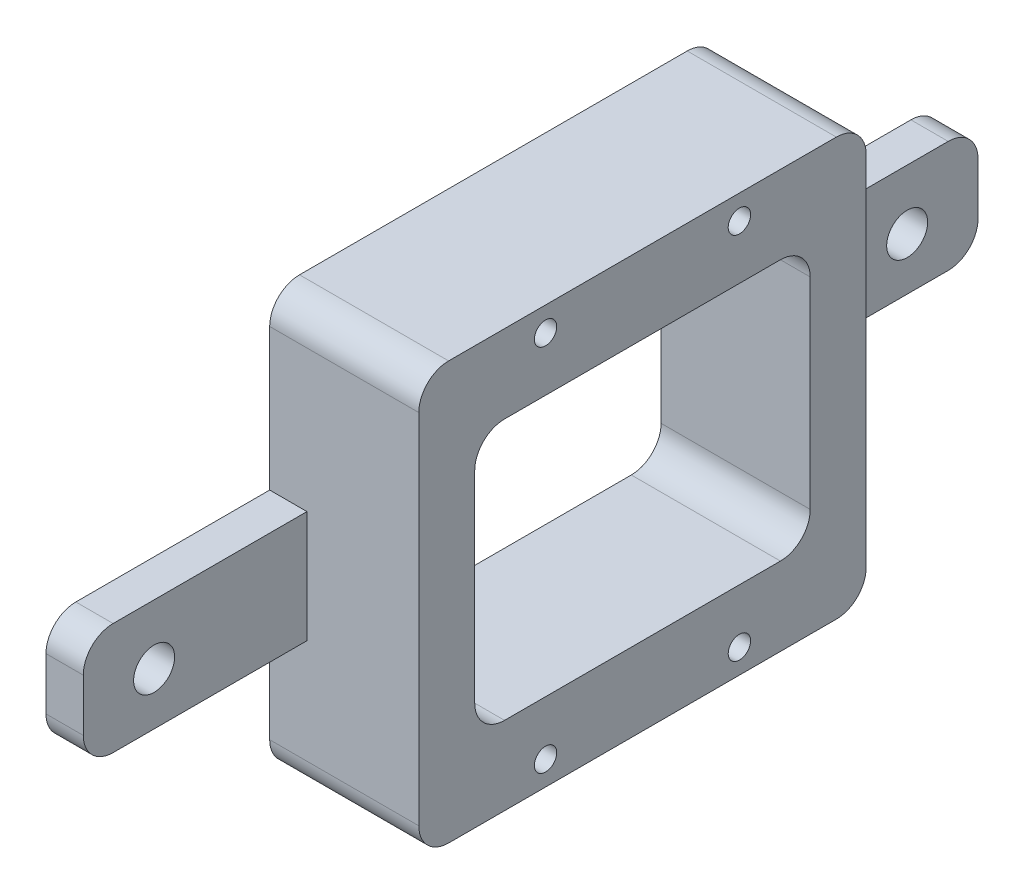
ISO-10303-21;
HEADER;
FILE_DESCRIPTION(('STEP AP214'),'2;1');
FILE_NAME('part.step','',(''),(''),'','','');
FILE_SCHEMA(('AUTOMOTIVE_DESIGN { 1 0 10303 214 1 1 1 1 }'));
ENDSEC;
DATA;
#1=APPLICATION_CONTEXT('core data for automotive mechanical design processes');
#2=APPLICATION_PROTOCOL_DEFINITION('international standard','automotive_design',2000,#1);
#3=PRODUCT_CONTEXT('',#1,'mechanical');
#4=PRODUCT('Part','Part','',(#3));
#5=PRODUCT_RELATED_PRODUCT_CATEGORY('part','',(#4));
#6=PRODUCT_DEFINITION_FORMATION('','',#4);
#7=PRODUCT_DEFINITION_CONTEXT('part definition',#1,'design');
#8=PRODUCT_DEFINITION('design','',#6,#7);
#9=PRODUCT_DEFINITION_SHAPE('','',#8);
#10=(LENGTH_UNIT() NAMED_UNIT(*) SI_UNIT(.MILLI.,.METRE.));
#11=(NAMED_UNIT(*) PLANE_ANGLE_UNIT() SI_UNIT($,.RADIAN.));
#12=(NAMED_UNIT(*) SI_UNIT($,.STERADIAN.) SOLID_ANGLE_UNIT());
#13=UNCERTAINTY_MEASURE_WITH_UNIT(LENGTH_MEASURE(1.E-05),#10,'distance_accuracy_value','');
#14=(GEOMETRIC_REPRESENTATION_CONTEXT(3) GLOBAL_UNCERTAINTY_ASSIGNED_CONTEXT((#13)) GLOBAL_UNIT_ASSIGNED_CONTEXT((#10,
#11,#12)) REPRESENTATION_CONTEXT('',''));
#15=CARTESIAN_POINT('',(0.,0.,0.));
#16=DIRECTION('',(0.,0.,1.));
#17=DIRECTION('',(1.,0.,0.));
#18=AXIS2_PLACEMENT_3D('',#15,#16,#17);
#19=CARTESIAN_POINT('',(20.,28.,30.));
#20=DIRECTION('',(0.,0.,-1.));
#21=DIRECTION('',(0.,1.,0.));
#22=AXIS2_PLACEMENT_3D('',#19,#20,#21);
#23=PLANE('',#22);
#24=DIRECTION('',(0.,-1.,0.));
#25=VECTOR('',#24,1.);
#26=CARTESIAN_POINT('',(20.,28.,30.));
#27=LINE('',#26,#25);
#28=CARTESIAN_POINT('',(20.,24.,30.));
#29=VERTEX_POINT('',#28);
#30=CARTESIAN_POINT('',(20.,-24.,30.));
#31=VERTEX_POINT('',#30);
#32=EDGE_CURVE('E327',#29,#31,#27,.T.);
#33=ORIENTED_EDGE('',*,*,#32,.F.);
#34=DIRECTION('',(-1.,0.,0.));
#35=VECTOR('',#34,1.);
#36=CARTESIAN_POINT('',(20.,24.,30.));
#37=LINE('',#36,#35);
#38=CARTESIAN_POINT('',(0.,24.,30.));
#39=VERTEX_POINT('',#38);
#40=EDGE_CURVE('E396',#29,#39,#37,.T.);
#41=ORIENTED_EDGE('',*,*,#40,.T.);
#42=DIRECTION('',(0.,-1.,0.));
#43=VECTOR('',#42,1.);
#44=CARTESIAN_POINT('',(0.,28.,30.));
#45=LINE('',#44,#43);
#46=CARTESIAN_POINT('',(0.,5.,30.));
#47=VERTEX_POINT('',#46);
#48=EDGE_CURVE('E344',#39,#47,#45,.T.);
#49=ORIENTED_EDGE('',*,*,#48,.T.);
#50=DIRECTION('',(1.,0.,0.));
#51=VECTOR('',#50,1.);
#52=CARTESIAN_POINT('',(0.,5.,30.));
#53=LINE('',#52,#51);
#54=CARTESIAN_POINT('',(5.,5.,30.));
#55=VERTEX_POINT('',#54);
#56=EDGE_CURVE('E294',#47,#55,#53,.T.);
#57=ORIENTED_EDGE('',*,*,#56,.T.);
#58=DIRECTION('',(0.,1.,0.));
#59=VECTOR('',#58,1.);
#60=CARTESIAN_POINT('',(5.,-10.,30.));
#61=LINE('',#60,#59);
#62=CARTESIAN_POINT('',(5.,-10.,30.));
#63=VERTEX_POINT('',#62);
#64=EDGE_CURVE('E284',#63,#55,#61,.T.);
#65=ORIENTED_EDGE('',*,*,#64,.F.);
#66=DIRECTION('',(1.,0.,0.));
#67=VECTOR('',#66,1.);
#68=CARTESIAN_POINT('',(0.,-10.,30.));
#69=LINE('',#68,#67);
#70=CARTESIAN_POINT('',(0.,-10.,30.));
#71=VERTEX_POINT('',#70);
#72=EDGE_CURVE('E299',#71,#63,#69,.T.);
#73=ORIENTED_EDGE('',*,*,#72,.F.);
#74=CARTESIAN_POINT('',(0.,-24.,30.));
#75=VERTEX_POINT('',#74);
#76=EDGE_CURVE('E292',#71,#75,#45,.T.);
#77=ORIENTED_EDGE('',*,*,#76,.T.);
#78=DIRECTION('',(-1.,0.,0.));
#79=VECTOR('',#78,1.);
#80=CARTESIAN_POINT('',(20.,-24.,30.));
#81=LINE('',#80,#79);
#82=EDGE_CURVE('E393',#75,#31,#81,.F.);
#83=ORIENTED_EDGE('',*,*,#82,.T.);
#84=EDGE_LOOP('',(#33,#41,#49,#57,#65,#73,#77,#83));
#85=FACE_BOUND('',#84,.T.);
#86=ADVANCED_FACE('F45',(#85),#23,.F.);
#87=CARTESIAN_POINT('',(20.,28.,-30.));
#88=DIRECTION('',(0.,0.,1.));
#89=DIRECTION('',(0.,-1.,0.));
#90=AXIS2_PLACEMENT_3D('',#87,#88,#89);
#91=PLANE('',#90);
#92=DIRECTION('',(0.,1.,0.));
#93=VECTOR('',#92,1.);
#94=CARTESIAN_POINT('',(0.,28.,-30.));
#95=LINE('',#94,#93);
#96=CARTESIAN_POINT('',(0.,5.,-30.));
#97=VERTEX_POINT('',#96);
#98=CARTESIAN_POINT('',(0.,24.,-30.));
#99=VERTEX_POINT('',#98);
#100=EDGE_CURVE('E245',#97,#99,#95,.T.);
#101=ORIENTED_EDGE('',*,*,#100,.T.);
#102=DIRECTION('',(-1.,0.,0.));
#103=VECTOR('',#102,1.);
#104=CARTESIAN_POINT('',(20.,24.,-30.));
#105=LINE('',#104,#103);
#106=CARTESIAN_POINT('',(20.,24.,-30.));
#107=VERTEX_POINT('',#106);
#108=EDGE_CURVE('E421',#99,#107,#105,.F.);
#109=ORIENTED_EDGE('',*,*,#108,.T.);
#110=DIRECTION('',(0.,1.,0.));
#111=VECTOR('',#110,1.);
#112=CARTESIAN_POINT('',(20.,28.,-30.));
#113=LINE('',#112,#111);
#114=CARTESIAN_POINT('',(20.,-24.,-30.));
#115=VERTEX_POINT('',#114);
#116=EDGE_CURVE('E335',#115,#107,#113,.T.);
#117=ORIENTED_EDGE('',*,*,#116,.F.);
#118=DIRECTION('',(-1.,0.,0.));
#119=VECTOR('',#118,1.);
#120=CARTESIAN_POINT('',(20.,-24.,-30.));
#121=LINE('',#120,#119);
#122=CARTESIAN_POINT('',(0.,-24.,-30.));
#123=VERTEX_POINT('',#122);
#124=EDGE_CURVE('E240',#115,#123,#121,.T.);
#125=ORIENTED_EDGE('',*,*,#124,.T.);
#126=CARTESIAN_POINT('',(0.,-9.99999999999999,-30.));
#127=VERTEX_POINT('',#126);
#128=EDGE_CURVE('E232',#123,#127,#95,.T.);
#129=ORIENTED_EDGE('',*,*,#128,.T.);
#130=DIRECTION('',(1.,0.,0.));
#131=VECTOR('',#130,1.);
#132=CARTESIAN_POINT('',(0.,-9.99999999999999,-30.));
#133=LINE('',#132,#131);
#134=CARTESIAN_POINT('',(5.,-9.99999999999999,-30.));
#135=VERTEX_POINT('',#134);
#136=EDGE_CURVE('E237',#127,#135,#133,.T.);
#137=ORIENTED_EDGE('',*,*,#136,.T.);
#138=DIRECTION('',(0.,-1.,0.));
#139=VECTOR('',#138,1.);
#140=CARTESIAN_POINT('',(5.,5.,-30.));
#141=LINE('',#140,#139);
#142=CARTESIAN_POINT('',(5.,5.,-30.));
#143=VERTEX_POINT('',#142);
#144=EDGE_CURVE('E281',#143,#135,#141,.T.);
#145=ORIENTED_EDGE('',*,*,#144,.F.);
#146=DIRECTION('',(1.,0.,0.));
#147=VECTOR('',#146,1.);
#148=CARTESIAN_POINT('',(0.,5.,-30.));
#149=LINE('',#148,#147);
#150=EDGE_CURVE('E257',#97,#143,#149,.T.);
#151=ORIENTED_EDGE('',*,*,#150,.F.);
#152=EDGE_LOOP('',(#101,#109,#117,#125,#129,#137,#145,#151));
#153=FACE_BOUND('',#152,.T.);
#154=ADVANCED_FACE('F235',(#153),#91,.F.);
#155=CARTESIAN_POINT('',(20.,-28.,30.));
#156=DIRECTION('',(0.,1.,0.));
#157=DIRECTION('',(0.,0.,1.));
#158=AXIS2_PLACEMENT_3D('',#155,#156,#157);
#159=PLANE('',#158);
#160=DIRECTION('',(0.,0.,-1.));
#161=VECTOR('',#160,1.);
#162=CARTESIAN_POINT('',(0.,-28.,30.));
#163=LINE('',#162,#161);
#164=CARTESIAN_POINT('',(0.,-28.,26.));
#165=VERTEX_POINT('',#164);
#166=CARTESIAN_POINT('',(0.,-28.,-26.));
#167=VERTEX_POINT('',#166);
#168=EDGE_CURVE('E347',#165,#167,#163,.T.);
#169=ORIENTED_EDGE('',*,*,#168,.T.);
#170=DIRECTION('',(-1.,0.,0.));
#171=VECTOR('',#170,1.);
#172=CARTESIAN_POINT('',(20.,-28.,-26.));
#173=LINE('',#172,#171);
#174=CARTESIAN_POINT('',(20.,-28.,-26.));
#175=VERTEX_POINT('',#174);
#176=EDGE_CURVE('E447',#167,#175,#173,.F.);
#177=ORIENTED_EDGE('',*,*,#176,.T.);
#178=DIRECTION('',(0.,0.,-1.));
#179=VECTOR('',#178,1.);
#180=CARTESIAN_POINT('',(20.,-28.,30.));
#181=LINE('',#180,#179);
#182=CARTESIAN_POINT('',(20.,-28.,26.));
#183=VERTEX_POINT('',#182);
#184=EDGE_CURVE('E331',#183,#175,#181,.T.);
#185=ORIENTED_EDGE('',*,*,#184,.F.);
#186=DIRECTION('',(-1.,0.,0.));
#187=VECTOR('',#186,1.);
#188=CARTESIAN_POINT('',(20.,-28.,26.));
#189=LINE('',#188,#187);
#190=EDGE_CURVE('E443',#183,#165,#189,.T.);
#191=ORIENTED_EDGE('',*,*,#190,.T.);
#192=EDGE_LOOP('',(#169,#177,#185,#191));
#193=FACE_BOUND('',#192,.T.);
#194=ADVANCED_FACE('F643',(#193),#159,.F.);
#195=CARTESIAN_POINT('',(20.,28.,30.));
#196=DIRECTION('',(0.,-1.,0.));
#197=DIRECTION('',(0.,0.,-1.));
#198=AXIS2_PLACEMENT_3D('',#195,#196,#197);
#199=PLANE('',#198);
#200=DIRECTION('',(0.,0.,1.));
#201=VECTOR('',#200,1.);
#202=CARTESIAN_POINT('',(0.,28.,30.));
#203=LINE('',#202,#201);
#204=CARTESIAN_POINT('',(0.,28.,-26.));
#205=VERTEX_POINT('',#204);
#206=CARTESIAN_POINT('',(0.,28.,26.));
#207=VERTEX_POINT('',#206);
#208=EDGE_CURVE('E244',#205,#207,#203,.T.);
#209=ORIENTED_EDGE('',*,*,#208,.T.);
#210=DIRECTION('',(-1.,0.,0.));
#211=VECTOR('',#210,1.);
#212=CARTESIAN_POINT('',(20.,28.,26.));
#213=LINE('',#212,#211);
#214=CARTESIAN_POINT('',(20.,28.,26.));
#215=VERTEX_POINT('',#214);
#216=EDGE_CURVE('E404',#207,#215,#213,.F.);
#217=ORIENTED_EDGE('',*,*,#216,.T.);
#218=DIRECTION('',(0.,0.,1.));
#219=VECTOR('',#218,1.);
#220=CARTESIAN_POINT('',(20.,28.,30.));
#221=LINE('',#220,#219);
#222=CARTESIAN_POINT('',(20.,28.,-26.));
#223=VERTEX_POINT('',#222);
#224=EDGE_CURVE('E339',#223,#215,#221,.T.);
#225=ORIENTED_EDGE('',*,*,#224,.F.);
#226=DIRECTION('',(-1.,0.,0.));
#227=VECTOR('',#226,1.);
#228=CARTESIAN_POINT('',(20.,28.,-26.));
#229=LINE('',#228,#227);
#230=EDGE_CURVE('E400',#223,#205,#229,.T.);
#231=ORIENTED_EDGE('',*,*,#230,.T.);
#232=EDGE_LOOP('',(#209,#217,#225,#231));
#233=FACE_BOUND('',#232,.T.);
#234=ADVANCED_FACE('F589',(#233),#199,.F.);
#235=CARTESIAN_POINT('',(20.,0.,0.));
#236=DIRECTION('',(1.,0.,0.));
#237=DIRECTION('',(0.,0.,-1.));
#238=AXIS2_PLACEMENT_3D('',#235,#236,#237);
#239=PLANE('',#238);
#240=DIRECTION('',(0.,-1.,0.));
#241=VECTOR('',#240,1.);
#242=CARTESIAN_POINT('',(20.,17.5,22.5));
#243=LINE('',#242,#241);
#244=CARTESIAN_POINT('',(20.,13.5,22.5));
#245=VERTEX_POINT('',#244);
#246=CARTESIAN_POINT('',(20.,-13.5,22.5));
#247=VERTEX_POINT('',#246);
#248=EDGE_CURVE('E533',#245,#247,#243,.T.);
#249=ORIENTED_EDGE('',*,*,#248,.F.);
#250=CARTESIAN_POINT('',(20.,13.5,18.5));
#251=DIRECTION('',(1.,0.,0.));
#252=DIRECTION('',(0.,0.,-1.));
#253=AXIS2_PLACEMENT_3D('',#250,#251,#252);
#254=CIRCLE('',#253,4.);
#255=CARTESIAN_POINT('',(20.,17.5,18.5));
#256=VERTEX_POINT('',#255);
#257=EDGE_CURVE('E492',#245,#256,#254,.F.);
#258=ORIENTED_EDGE('',*,*,#257,.T.);
#259=DIRECTION('',(0.,0.,1.));
#260=VECTOR('',#259,1.);
#261=CARTESIAN_POINT('',(20.,17.5,22.5));
#262=LINE('',#261,#260);
#263=CARTESIAN_POINT('',(20.,17.5,-18.5));
#264=VERTEX_POINT('',#263);
#265=EDGE_CURVE('E506',#264,#256,#262,.T.);
#266=ORIENTED_EDGE('',*,*,#265,.F.);
#267=CARTESIAN_POINT('',(20.,13.5,-18.5));
#268=DIRECTION('',(1.,0.,0.));
#269=DIRECTION('',(0.,0.,-1.));
#270=AXIS2_PLACEMENT_3D('',#267,#268,#269);
#271=CIRCLE('',#270,4.);
#272=CARTESIAN_POINT('',(20.,13.5,-22.5));
#273=VERTEX_POINT('',#272);
#274=EDGE_CURVE('E54',#264,#273,#271,.F.);
#275=ORIENTED_EDGE('',*,*,#274,.T.);
#276=DIRECTION('',(0.,1.,0.));
#277=VECTOR('',#276,1.);
#278=CARTESIAN_POINT('',(20.,17.5,-22.5));
#279=LINE('',#278,#277);
#280=CARTESIAN_POINT('',(20.,-13.5,-22.5));
#281=VERTEX_POINT('',#280);
#282=EDGE_CURVE('E505',#281,#273,#279,.T.);
#283=ORIENTED_EDGE('',*,*,#282,.F.);
#284=CARTESIAN_POINT('',(20.,-13.5,-18.5));
#285=DIRECTION('',(1.,0.,0.));
#286=DIRECTION('',(0.,0.,-1.));
#287=AXIS2_PLACEMENT_3D('',#284,#285,#286);
#288=CIRCLE('',#287,4.);
#289=CARTESIAN_POINT('',(20.,-17.5,-18.5));
#290=VERTEX_POINT('',#289);
#291=EDGE_CURVE('E480',#281,#290,#288,.F.);
#292=ORIENTED_EDGE('',*,*,#291,.T.);
#293=DIRECTION('',(0.,0.,-1.));
#294=VECTOR('',#293,1.);
#295=CARTESIAN_POINT('',(20.,-17.5,22.5));
#296=LINE('',#295,#294);
#297=CARTESIAN_POINT('',(20.,-17.5,18.5));
#298=VERTEX_POINT('',#297);
#299=EDGE_CURVE('E515',#298,#290,#296,.T.);
#300=ORIENTED_EDGE('',*,*,#299,.F.);
#301=CARTESIAN_POINT('',(20.,-13.5,18.5));
#302=DIRECTION('',(1.,0.,0.));
#303=DIRECTION('',(0.,0.,-1.));
#304=AXIS2_PLACEMENT_3D('',#301,#302,#303);
#305=CIRCLE('',#304,4.);
#306=EDGE_CURVE('E486',#298,#247,#305,.F.);
#307=ORIENTED_EDGE('',*,*,#306,.T.);
#308=EDGE_LOOP('',(#249,#258,#266,#275,#283,#292,#300,#307));
#309=FACE_BOUND('',#308,.T.);
#310=CARTESIAN_POINT('',(20.,-24.75,13.));
#311=DIRECTION('',(1.,0.,0.));
#312=DIRECTION('',(0.,0.,-1.));
#313=AXIS2_PLACEMENT_3D('',#310,#311,#312);
#314=CIRCLE('',#313,1.5);
#315=CARTESIAN_POINT('',(20.,-24.75,11.5));
#316=VERTEX_POINT('',#315);
#317=EDGE_CURVE('E571',#316,#316,#314,.T.);
#318=ORIENTED_EDGE('',*,*,#317,.F.);
#319=EDGE_LOOP('',(#318));
#320=FACE_BOUND('',#319,.T.);
#321=CARTESIAN_POINT('',(20.,-24.75,-13.));
#322=DIRECTION('',(1.,0.,0.));
#323=DIRECTION('',(0.,0.,-1.));
#324=AXIS2_PLACEMENT_3D('',#321,#322,#323);
#325=CIRCLE('',#324,1.5);
#326=CARTESIAN_POINT('',(20.,-24.75,-14.5));
#327=VERTEX_POINT('',#326);
#328=EDGE_CURVE('E563',#327,#327,#325,.T.);
#329=ORIENTED_EDGE('',*,*,#328,.F.);
#330=EDGE_LOOP('',(#329));
#331=FACE_BOUND('',#330,.T.);
#332=CARTESIAN_POINT('',(20.,24.75,-13.));
#333=DIRECTION('',(1.,0.,0.));
#334=DIRECTION('',(0.,0.,-1.));
#335=AXIS2_PLACEMENT_3D('',#332,#333,#334);
#336=CIRCLE('',#335,1.5);
#337=CARTESIAN_POINT('',(20.,24.75,-14.5));
#338=VERTEX_POINT('',#337);
#339=EDGE_CURVE('E555',#338,#338,#336,.T.);
#340=ORIENTED_EDGE('',*,*,#339,.F.);
#341=EDGE_LOOP('',(#340));
#342=FACE_BOUND('',#341,.T.);
#343=CARTESIAN_POINT('',(20.,24.75,13.));
#344=DIRECTION('',(1.,0.,0.));
#345=DIRECTION('',(0.,0.,-1.));
#346=AXIS2_PLACEMENT_3D('',#343,#344,#345);
#347=CIRCLE('',#346,1.5);
#348=CARTESIAN_POINT('',(20.,24.75,11.5));
#349=VERTEX_POINT('',#348);
#350=EDGE_CURVE('E276',#349,#349,#347,.T.);
#351=ORIENTED_EDGE('',*,*,#350,.F.);
#352=EDGE_LOOP('',(#351));
#353=FACE_BOUND('',#352,.T.);
#354=ORIENTED_EDGE('',*,*,#224,.T.);
#355=CARTESIAN_POINT('',(20.,24.,26.));
#356=DIRECTION('',(1.,0.,0.));
#357=DIRECTION('',(0.,0.,-1.));
#358=AXIS2_PLACEMENT_3D('',#355,#356,#357);
#359=CIRCLE('',#358,4.);
#360=EDGE_CURVE('E416',#215,#29,#359,.T.);
#361=ORIENTED_EDGE('',*,*,#360,.T.);
#362=ORIENTED_EDGE('',*,*,#32,.T.);
#363=CARTESIAN_POINT('',(20.,-24.,26.));
#364=DIRECTION('',(1.,0.,0.));
#365=DIRECTION('',(0.,0.,-1.));
#366=AXIS2_PLACEMENT_3D('',#363,#364,#365);
#367=CIRCLE('',#366,4.);
#368=EDGE_CURVE('E407',#31,#183,#367,.T.);
#369=ORIENTED_EDGE('',*,*,#368,.T.);
#370=ORIENTED_EDGE('',*,*,#184,.T.);
#371=CARTESIAN_POINT('',(20.,-24.,-26.));
#372=DIRECTION('',(1.,0.,0.));
#373=DIRECTION('',(0.,0.,-1.));
#374=AXIS2_PLACEMENT_3D('',#371,#372,#373);
#375=CIRCLE('',#374,4.);
#376=EDGE_CURVE('E410',#175,#115,#375,.T.);
#377=ORIENTED_EDGE('',*,*,#376,.T.);
#378=ORIENTED_EDGE('',*,*,#116,.T.);
#379=CARTESIAN_POINT('',(20.,24.,-26.));
#380=DIRECTION('',(1.,0.,0.));
#381=DIRECTION('',(0.,0.,-1.));
#382=AXIS2_PLACEMENT_3D('',#379,#380,#381);
#383=CIRCLE('',#382,4.);
#384=EDGE_CURVE('E413',#107,#223,#383,.T.);
#385=ORIENTED_EDGE('',*,*,#384,.T.);
#386=EDGE_LOOP('',(#354,#361,#362,#369,#370,#377,#378,#385));
#387=FACE_BOUND('',#386,.T.);
#388=ADVANCED_FACE('F503',(#309,#320,#331,#342,#353,#387),#239,.T.);
#389=CARTESIAN_POINT('',(0.,0.,0.));
#390=DIRECTION('',(1.,0.,0.));
#391=DIRECTION('',(0.,0.,-1.));
#392=AXIS2_PLACEMENT_3D('',#389,#390,#391);
#393=PLANE('',#392);
#394=DIRECTION('',(0.,1.,0.));
#395=VECTOR('',#394,1.);
#396=CARTESIAN_POINT('',(0.,17.5,-22.5));
#397=LINE('',#396,#395);
#398=CARTESIAN_POINT('',(0.,-13.5,-22.5));
#399=VERTEX_POINT('',#398);
#400=CARTESIAN_POINT('',(0.,13.5,-22.5));
#401=VERTEX_POINT('',#400);
#402=EDGE_CURVE('E522',#399,#401,#397,.T.);
#403=ORIENTED_EDGE('',*,*,#402,.T.);
#404=CARTESIAN_POINT('',(0.,13.5,-18.5));
#405=DIRECTION('',(1.,0.,0.));
#406=DIRECTION('',(0.,0.,-1.));
#407=AXIS2_PLACEMENT_3D('',#404,#405,#406);
#408=CIRCLE('',#407,4.);
#409=CARTESIAN_POINT('',(0.,17.5,-18.5));
#410=VERTEX_POINT('',#409);
#411=EDGE_CURVE('E11',#401,#410,#408,.T.);
#412=ORIENTED_EDGE('',*,*,#411,.T.);
#413=DIRECTION('',(0.,0.,1.));
#414=VECTOR('',#413,1.);
#415=CARTESIAN_POINT('',(0.,17.5,22.5));
#416=LINE('',#415,#414);
#417=CARTESIAN_POINT('',(0.,17.5,18.5));
#418=VERTEX_POINT('',#417);
#419=EDGE_CURVE('E518',#410,#418,#416,.T.);
#420=ORIENTED_EDGE('',*,*,#419,.T.);
#421=CARTESIAN_POINT('',(0.,13.5,18.5));
#422=DIRECTION('',(1.,0.,0.));
#423=DIRECTION('',(0.,0.,-1.));
#424=AXIS2_PLACEMENT_3D('',#421,#422,#423);
#425=CIRCLE('',#424,4.);
#426=CARTESIAN_POINT('',(0.,13.5,22.5));
#427=VERTEX_POINT('',#426);
#428=EDGE_CURVE('E495',#418,#427,#425,.T.);
#429=ORIENTED_EDGE('',*,*,#428,.T.);
#430=DIRECTION('',(0.,-1.,0.));
#431=VECTOR('',#430,1.);
#432=CARTESIAN_POINT('',(0.,17.5,22.5));
#433=LINE('',#432,#431);
#434=CARTESIAN_POINT('',(0.,-13.5,22.5));
#435=VERTEX_POINT('',#434);
#436=EDGE_CURVE('E542',#427,#435,#433,.T.);
#437=ORIENTED_EDGE('',*,*,#436,.T.);
#438=CARTESIAN_POINT('',(0.,-13.5,18.5));
#439=DIRECTION('',(1.,0.,0.));
#440=DIRECTION('',(0.,0.,-1.));
#441=AXIS2_PLACEMENT_3D('',#438,#439,#440);
#442=CIRCLE('',#441,4.);
#443=CARTESIAN_POINT('',(0.,-17.5,18.5));
#444=VERTEX_POINT('',#443);
#445=EDGE_CURVE('E489',#435,#444,#442,.T.);
#446=ORIENTED_EDGE('',*,*,#445,.T.);
#447=DIRECTION('',(0.,0.,-1.));
#448=VECTOR('',#447,1.);
#449=CARTESIAN_POINT('',(0.,-17.5,22.5));
#450=LINE('',#449,#448);
#451=CARTESIAN_POINT('',(0.,-17.5,-18.5));
#452=VERTEX_POINT('',#451);
#453=EDGE_CURVE('E529',#444,#452,#450,.T.);
#454=ORIENTED_EDGE('',*,*,#453,.T.);
#455=CARTESIAN_POINT('',(0.,-13.5,-18.5));
#456=DIRECTION('',(1.,0.,0.));
#457=DIRECTION('',(0.,0.,-1.));
#458=AXIS2_PLACEMENT_3D('',#455,#456,#457);
#459=CIRCLE('',#458,4.);
#460=EDGE_CURVE('E483',#452,#399,#459,.T.);
#461=ORIENTED_EDGE('',*,*,#460,.T.);
#462=EDGE_LOOP('',(#403,#412,#420,#429,#437,#446,#454,#461));
#463=FACE_BOUND('',#462,.T.);
#464=CARTESIAN_POINT('',(0.,-3.,50.5));
#465=DIRECTION('',(1.,0.,0.));
#466=DIRECTION('',(0.,0.,-1.));
#467=AXIS2_PLACEMENT_3D('',#464,#465,#466);
#468=CIRCLE('',#467,2.75);
#469=CARTESIAN_POINT('',(0.,-3.,47.75));
#470=VERTEX_POINT('',#469);
#471=EDGE_CURVE('E543',#470,#470,#468,.T.);
#472=ORIENTED_EDGE('',*,*,#471,.T.);
#473=EDGE_LOOP('',(#472));
#474=FACE_BOUND('',#473,.T.);
#475=CARTESIAN_POINT('',(0.,-3.,-50.5));
#476=DIRECTION('',(1.,0.,0.));
#477=DIRECTION('',(0.,0.,-1.));
#478=AXIS2_PLACEMENT_3D('',#475,#476,#477);
#479=CIRCLE('',#478,2.75);
#480=CARTESIAN_POINT('',(0.,-3.,-53.25));
#481=VERTEX_POINT('',#480);
#482=EDGE_CURVE('E521',#481,#481,#479,.T.);
#483=ORIENTED_EDGE('',*,*,#482,.T.);
#484=EDGE_LOOP('',(#483));
#485=FACE_BOUND('',#484,.T.);
#486=CARTESIAN_POINT('',(0.,-24.75,13.));
#487=DIRECTION('',(1.,0.,0.));
#488=DIRECTION('',(0.,0.,-1.));
#489=AXIS2_PLACEMENT_3D('',#486,#487,#488);
#490=CIRCLE('',#489,1.5);
#491=CARTESIAN_POINT('',(0.,-24.75,11.5));
#492=VERTEX_POINT('',#491);
#493=EDGE_CURVE('E547',#492,#492,#490,.T.);
#494=ORIENTED_EDGE('',*,*,#493,.T.);
#495=EDGE_LOOP('',(#494));
#496=FACE_BOUND('',#495,.T.);
#497=CARTESIAN_POINT('',(0.,-24.75,-13.));
#498=DIRECTION('',(1.,0.,0.));
#499=DIRECTION('',(0.,0.,-1.));
#500=AXIS2_PLACEMENT_3D('',#497,#498,#499);
#501=CIRCLE('',#500,1.5);
#502=CARTESIAN_POINT('',(0.,-24.75,-14.5));
#503=VERTEX_POINT('',#502);
#504=EDGE_CURVE('E567',#503,#503,#501,.T.);
#505=ORIENTED_EDGE('',*,*,#504,.T.);
#506=EDGE_LOOP('',(#505));
#507=FACE_BOUND('',#506,.T.);
#508=CARTESIAN_POINT('',(0.,24.75,-13.));
#509=DIRECTION('',(1.,0.,0.));
#510=DIRECTION('',(0.,0.,-1.));
#511=AXIS2_PLACEMENT_3D('',#508,#509,#510);
#512=CIRCLE('',#511,1.5);
#513=CARTESIAN_POINT('',(0.,24.75,-14.5));
#514=VERTEX_POINT('',#513);
#515=EDGE_CURVE('E559',#514,#514,#512,.T.);
#516=ORIENTED_EDGE('',*,*,#515,.T.);
#517=EDGE_LOOP('',(#516));
#518=FACE_BOUND('',#517,.T.);
#519=CARTESIAN_POINT('',(0.,24.75,13.));
#520=DIRECTION('',(1.,0.,0.));
#521=DIRECTION('',(0.,0.,-1.));
#522=AXIS2_PLACEMENT_3D('',#519,#520,#521);
#523=CIRCLE('',#522,1.5);
#524=CARTESIAN_POINT('',(0.,24.75,11.5));
#525=VERTEX_POINT('',#524);
#526=EDGE_CURVE('E303',#525,#525,#523,.T.);
#527=ORIENTED_EDGE('',*,*,#526,.T.);
#528=EDGE_LOOP('',(#527));
#529=FACE_BOUND('',#528,.T.);
#530=DIRECTION('',(0.,-1.,0.));
#531=VECTOR('',#530,1.);
#532=CARTESIAN_POINT('',(0.,-10.,60.));
#533=LINE('',#532,#531);
#534=CARTESIAN_POINT('',(0.,0.999999999999992,60.));
#535=VERTEX_POINT('',#534);
#536=CARTESIAN_POINT('',(0.,-6.00000000000001,60.));
#537=VERTEX_POINT('',#536);
#538=EDGE_CURVE('E320',#535,#537,#533,.T.);
#539=ORIENTED_EDGE('',*,*,#538,.F.);
#540=CARTESIAN_POINT('',(0.,0.999999999999993,56.));
#541=DIRECTION('',(1.,0.,0.));
#542=DIRECTION('',(0.,0.,-1.));
#543=AXIS2_PLACEMENT_3D('',#540,#541,#542);
#544=CIRCLE('',#543,4.);
#545=CARTESIAN_POINT('',(0.,4.99999999999999,56.));
#546=VERTEX_POINT('',#545);
#547=EDGE_CURVE('E390',#535,#546,#544,.F.);
#548=ORIENTED_EDGE('',*,*,#547,.T.);
#549=DIRECTION('',(0.,0.,1.));
#550=VECTOR('',#549,1.);
#551=CARTESIAN_POINT('',(0.,5.,30.));
#552=LINE('',#551,#550);
#553=EDGE_CURVE('E308',#47,#546,#552,.T.);
#554=ORIENTED_EDGE('',*,*,#553,.F.);
#555=ORIENTED_EDGE('',*,*,#48,.F.);
#556=CARTESIAN_POINT('',(0.,24.,26.));
#557=DIRECTION('',(1.,0.,0.));
#558=DIRECTION('',(0.,0.,-1.));
#559=AXIS2_PLACEMENT_3D('',#556,#557,#558);
#560=CIRCLE('',#559,4.);
#561=EDGE_CURVE('E387',#39,#207,#560,.F.);
#562=ORIENTED_EDGE('',*,*,#561,.T.);
#563=ORIENTED_EDGE('',*,*,#208,.F.);
#564=CARTESIAN_POINT('',(0.,24.,-26.));
#565=DIRECTION('',(1.,0.,0.));
#566=DIRECTION('',(0.,0.,-1.));
#567=AXIS2_PLACEMENT_3D('',#564,#565,#566);
#568=CIRCLE('',#567,4.);
#569=EDGE_CURVE('E384',#205,#99,#568,.F.);
#570=ORIENTED_EDGE('',*,*,#569,.T.);
#571=ORIENTED_EDGE('',*,*,#100,.F.);
#572=DIRECTION('',(0.,0.,1.));
#573=VECTOR('',#572,1.);
#574=CARTESIAN_POINT('',(0.,5.,-30.));
#575=LINE('',#574,#573);
#576=CARTESIAN_POINT('',(0.,5.,-56.));
#577=VERTEX_POINT('',#576);
#578=EDGE_CURVE('E258',#577,#97,#575,.T.);
#579=ORIENTED_EDGE('',*,*,#578,.F.);
#580=CARTESIAN_POINT('',(0.,1.,-56.));
#581=DIRECTION('',(1.,0.,0.));
#582=DIRECTION('',(0.,0.,-1.));
#583=AXIS2_PLACEMENT_3D('',#580,#581,#582);
#584=CIRCLE('',#583,4.);
#585=CARTESIAN_POINT('',(0.,1.,-60.));
#586=VERTEX_POINT('',#585);
#587=EDGE_CURVE('E381',#577,#586,#584,.F.);
#588=ORIENTED_EDGE('',*,*,#587,.T.);
#589=DIRECTION('',(0.,1.,0.));
#590=VECTOR('',#589,1.);
#591=CARTESIAN_POINT('',(0.,5.,-60.));
#592=LINE('',#591,#590);
#593=CARTESIAN_POINT('',(0.,-6.,-60.));
#594=VERTEX_POINT('',#593);
#595=EDGE_CURVE('E266',#594,#586,#592,.T.);
#596=ORIENTED_EDGE('',*,*,#595,.F.);
#597=CARTESIAN_POINT('',(0.,-6.,-56.));
#598=DIRECTION('',(1.,0.,0.));
#599=DIRECTION('',(0.,0.,-1.));
#600=AXIS2_PLACEMENT_3D('',#597,#598,#599);
#601=CIRCLE('',#600,4.);
#602=CARTESIAN_POINT('',(0.,-10.,-56.));
#603=VERTEX_POINT('',#602);
#604=EDGE_CURVE('E264',#594,#603,#601,.F.);
#605=ORIENTED_EDGE('',*,*,#604,.T.);
#606=DIRECTION('',(0.,0.,-1.));
#607=VECTOR('',#606,1.);
#608=CARTESIAN_POINT('',(0.,-9.99999999999999,-30.));
#609=LINE('',#608,#607);
#610=EDGE_CURVE('E252',#127,#603,#609,.T.);
#611=ORIENTED_EDGE('',*,*,#610,.F.);
#612=ORIENTED_EDGE('',*,*,#128,.F.);
#613=CARTESIAN_POINT('',(0.,-24.,-26.));
#614=DIRECTION('',(1.,0.,0.));
#615=DIRECTION('',(0.,0.,-1.));
#616=AXIS2_PLACEMENT_3D('',#613,#614,#615);
#617=CIRCLE('',#616,4.);
#618=EDGE_CURVE('E376',#123,#167,#617,.F.);
#619=ORIENTED_EDGE('',*,*,#618,.T.);
#620=ORIENTED_EDGE('',*,*,#168,.F.);
#621=CARTESIAN_POINT('',(0.,-24.,26.));
#622=DIRECTION('',(1.,0.,0.));
#623=DIRECTION('',(0.,0.,-1.));
#624=AXIS2_PLACEMENT_3D('',#621,#622,#623);
#625=CIRCLE('',#624,4.);
#626=EDGE_CURVE('E373',#165,#75,#625,.F.);
#627=ORIENTED_EDGE('',*,*,#626,.T.);
#628=ORIENTED_EDGE('',*,*,#76,.F.);
#629=DIRECTION('',(0.,0.,-1.));
#630=VECTOR('',#629,1.);
#631=CARTESIAN_POINT('',(0.,-10.,30.));
#632=LINE('',#631,#630);
#633=CARTESIAN_POINT('',(0.,-10.,56.));
#634=VERTEX_POINT('',#633);
#635=EDGE_CURVE('E298',#634,#71,#632,.T.);
#636=ORIENTED_EDGE('',*,*,#635,.F.);
#637=CARTESIAN_POINT('',(0.,-6.00000000000001,56.));
#638=DIRECTION('',(1.,0.,0.));
#639=DIRECTION('',(0.,0.,-1.));
#640=AXIS2_PLACEMENT_3D('',#637,#638,#639);
#641=CIRCLE('',#640,4.);
#642=EDGE_CURVE('E370',#634,#537,#641,.F.);
#643=ORIENTED_EDGE('',*,*,#642,.T.);
#644=EDGE_LOOP('',(#539,#548,#554,#555,#562,#563,#570,#571,#579,#588,#596,#605,#611,#612,#619,
#620,#627,#628,#636,#643));
#645=FACE_BOUND('',#644,.T.);
#646=ADVANCED_FACE('F261',(#463,#474,#485,#496,#507,#518,#529,#645),#393,.F.);
#647=CARTESIAN_POINT('',(0.,5.,-30.));
#648=DIRECTION('',(0.,1.,0.));
#649=DIRECTION('',(0.,0.,1.));
#650=AXIS2_PLACEMENT_3D('',#647,#648,#649);
#651=PLANE('',#650);
#652=DIRECTION('',(0.,0.,1.));
#653=VECTOR('',#652,1.);
#654=CARTESIAN_POINT('',(5.,5.,-30.));
#655=LINE('',#654,#653);
#656=CARTESIAN_POINT('',(5.,5.,-56.));
#657=VERTEX_POINT('',#656);
#658=EDGE_CURVE('E267',#657,#143,#655,.T.);
#659=ORIENTED_EDGE('',*,*,#658,.F.);
#660=DIRECTION('',(1.,0.,0.));
#661=VECTOR('',#660,1.);
#662=CARTESIAN_POINT('',(0.,5.,-56.));
#663=LINE('',#662,#661);
#664=EDGE_CURVE('E437',#657,#577,#663,.F.);
#665=ORIENTED_EDGE('',*,*,#664,.T.);
#666=ORIENTED_EDGE('',*,*,#578,.T.);
#667=ORIENTED_EDGE('',*,*,#150,.T.);
#668=EDGE_LOOP('',(#659,#665,#666,#667));
#669=FACE_BOUND('',#668,.T.);
#670=ADVANCED_FACE('F752',(#669),#651,.T.);
#671=CARTESIAN_POINT('',(0.,5.,-60.));
#672=DIRECTION('',(0.,0.,-1.));
#673=DIRECTION('',(-1.,0.,0.));
#674=AXIS2_PLACEMENT_3D('',#671,#672,#673);
#675=PLANE('',#674);
#676=ORIENTED_EDGE('',*,*,#595,.T.);
#677=DIRECTION('',(1.,0.,0.));
#678=VECTOR('',#677,1.);
#679=CARTESIAN_POINT('',(0.,1.,-60.));
#680=LINE('',#679,#678);
#681=CARTESIAN_POINT('',(5.,1.,-60.));
#682=VERTEX_POINT('',#681);
#683=EDGE_CURVE('E427',#586,#682,#680,.T.);
#684=ORIENTED_EDGE('',*,*,#683,.T.);
#685=DIRECTION('',(0.,1.,0.));
#686=VECTOR('',#685,1.);
#687=CARTESIAN_POINT('',(5.,5.,-60.));
#688=LINE('',#687,#686);
#689=CARTESIAN_POINT('',(5.,-6.,-60.));
#690=VERTEX_POINT('',#689);
#691=EDGE_CURVE('E273',#690,#682,#688,.T.);
#692=ORIENTED_EDGE('',*,*,#691,.F.);
#693=DIRECTION('',(1.,0.,0.));
#694=VECTOR('',#693,1.);
#695=CARTESIAN_POINT('',(0.,-6.,-60.));
#696=LINE('',#695,#694);
#697=EDGE_CURVE('E424',#690,#594,#696,.F.);
#698=ORIENTED_EDGE('',*,*,#697,.T.);
#699=EDGE_LOOP('',(#676,#684,#692,#698));
#700=FACE_BOUND('',#699,.T.);
#701=ADVANCED_FACE('F754',(#700),#675,.T.);
#702=CARTESIAN_POINT('',(0.,-9.99999999999999,-30.));
#703=DIRECTION('',(0.,-1.,0.));
#704=DIRECTION('',(0.,0.,-1.));
#705=AXIS2_PLACEMENT_3D('',#702,#703,#704);
#706=PLANE('',#705);
#707=ORIENTED_EDGE('',*,*,#610,.T.);
#708=DIRECTION('',(1.,0.,0.));
#709=VECTOR('',#708,1.);
#710=CARTESIAN_POINT('',(0.,-10.,-56.));
#711=LINE('',#710,#709);
#712=CARTESIAN_POINT('',(5.,-10.,-56.));
#713=VERTEX_POINT('',#712);
#714=EDGE_CURVE('E440',#603,#713,#711,.T.);
#715=ORIENTED_EDGE('',*,*,#714,.T.);
#716=DIRECTION('',(0.,0.,-1.));
#717=VECTOR('',#716,1.);
#718=CARTESIAN_POINT('',(5.,-9.99999999999999,-30.));
#719=LINE('',#718,#717);
#720=EDGE_CURVE('E255',#135,#713,#719,.T.);
#721=ORIENTED_EDGE('',*,*,#720,.F.);
#722=ORIENTED_EDGE('',*,*,#136,.F.);
#723=EDGE_LOOP('',(#707,#715,#721,#722));
#724=FACE_BOUND('',#723,.T.);
#725=ADVANCED_FACE('F250',(#724),#706,.T.);
#726=CARTESIAN_POINT('',(5.,0.,0.));
#727=DIRECTION('',(1.,0.,0.));
#728=DIRECTION('',(0.,0.,-1.));
#729=AXIS2_PLACEMENT_3D('',#726,#727,#728);
#730=PLANE('',#729);
#731=CARTESIAN_POINT('',(5.,-3.,-50.5));
#732=DIRECTION('',(1.,0.,0.));
#733=DIRECTION('',(0.,0.,-1.));
#734=AXIS2_PLACEMENT_3D('',#731,#732,#733);
#735=CIRCLE('',#734,2.75);
#736=CARTESIAN_POINT('',(5.,-3.,-53.25));
#737=VERTEX_POINT('',#736);
#738=EDGE_CURVE('E527',#737,#737,#735,.T.);
#739=ORIENTED_EDGE('',*,*,#738,.F.);
#740=EDGE_LOOP('',(#739));
#741=FACE_BOUND('',#740,.T.);
#742=ORIENTED_EDGE('',*,*,#691,.T.);
#743=CARTESIAN_POINT('',(5.,1.,-56.));
#744=DIRECTION('',(1.,0.,0.));
#745=DIRECTION('',(0.,0.,-1.));
#746=AXIS2_PLACEMENT_3D('',#743,#744,#745);
#747=CIRCLE('',#746,4.);
#748=EDGE_CURVE('E434',#682,#657,#747,.T.);
#749=ORIENTED_EDGE('',*,*,#748,.T.);
#750=ORIENTED_EDGE('',*,*,#658,.T.);
#751=ORIENTED_EDGE('',*,*,#144,.T.);
#752=ORIENTED_EDGE('',*,*,#720,.T.);
#753=CARTESIAN_POINT('',(5.,-6.,-56.));
#754=DIRECTION('',(1.,0.,0.));
#755=DIRECTION('',(0.,0.,-1.));
#756=AXIS2_PLACEMENT_3D('',#753,#754,#755);
#757=CIRCLE('',#756,4.);
#758=EDGE_CURVE('E431',#713,#690,#757,.T.);
#759=ORIENTED_EDGE('',*,*,#758,.T.);
#760=EDGE_LOOP('',(#742,#749,#750,#751,#752,#759));
#761=FACE_BOUND('',#760,.T.);
#762=ADVANCED_FACE('F748',(#741,#761),#730,.T.);
#763=CARTESIAN_POINT('',(0.,-10.,30.));
#764=DIRECTION('',(0.,-1.,0.));
#765=DIRECTION('',(0.,0.,-1.));
#766=AXIS2_PLACEMENT_3D('',#763,#764,#765);
#767=PLANE('',#766);
#768=DIRECTION('',(0.,0.,-1.));
#769=VECTOR('',#768,1.);
#770=CARTESIAN_POINT('',(5.,-10.,30.));
#771=LINE('',#770,#769);
#772=CARTESIAN_POINT('',(5.,-10.,56.));
#773=VERTEX_POINT('',#772);
#774=EDGE_CURVE('E304',#773,#63,#771,.T.);
#775=ORIENTED_EDGE('',*,*,#774,.F.);
#776=DIRECTION('',(1.,0.,0.));
#777=VECTOR('',#776,1.);
#778=CARTESIAN_POINT('',(0.,-10.,56.));
#779=LINE('',#778,#777);
#780=EDGE_CURVE('E450',#773,#634,#779,.F.);
#781=ORIENTED_EDGE('',*,*,#780,.T.);
#782=ORIENTED_EDGE('',*,*,#635,.T.);
#783=ORIENTED_EDGE('',*,*,#72,.T.);
#784=EDGE_LOOP('',(#775,#781,#782,#783));
#785=FACE_BOUND('',#784,.T.);
#786=ADVANCED_FACE('F626',(#785),#767,.T.);
#787=CARTESIAN_POINT('',(0.,-10.,60.));
#788=DIRECTION('',(0.,0.,1.));
#789=DIRECTION('',(1.,0.,0.));
#790=AXIS2_PLACEMENT_3D('',#787,#788,#789);
#791=PLANE('',#790);
#792=DIRECTION('',(0.,-1.,0.));
#793=VECTOR('',#792,1.);
#794=CARTESIAN_POINT('',(5.,-10.,60.));
#795=LINE('',#794,#793);
#796=CARTESIAN_POINT('',(5.,0.999999999999992,60.));
#797=VERTEX_POINT('',#796);
#798=CARTESIAN_POINT('',(5.,-6.00000000000001,60.));
#799=VERTEX_POINT('',#798);
#800=EDGE_CURVE('E307',#797,#799,#795,.T.);
#801=ORIENTED_EDGE('',*,*,#800,.F.);
#802=DIRECTION('',(1.,0.,0.));
#803=VECTOR('',#802,1.);
#804=CARTESIAN_POINT('',(0.,0.999999999999992,60.));
#805=LINE('',#804,#803);
#806=EDGE_CURVE('E367',#797,#535,#805,.F.);
#807=ORIENTED_EDGE('',*,*,#806,.T.);
#808=ORIENTED_EDGE('',*,*,#538,.T.);
#809=DIRECTION('',(1.,0.,0.));
#810=VECTOR('',#809,1.);
#811=CARTESIAN_POINT('',(0.,-6.00000000000001,60.));
#812=LINE('',#811,#810);
#813=EDGE_CURVE('E363',#537,#799,#812,.T.);
#814=ORIENTED_EDGE('',*,*,#813,.T.);
#815=EDGE_LOOP('',(#801,#807,#808,#814));
#816=FACE_BOUND('',#815,.T.);
#817=ADVANCED_FACE('F618',(#816),#791,.T.);
#818=CARTESIAN_POINT('',(0.,5.,30.));
#819=DIRECTION('',(0.,1.,0.));
#820=DIRECTION('',(0.,0.,1.));
#821=AXIS2_PLACEMENT_3D('',#818,#819,#820);
#822=PLANE('',#821);
#823=ORIENTED_EDGE('',*,*,#553,.T.);
#824=DIRECTION('',(1.,0.,0.));
#825=VECTOR('',#824,1.);
#826=CARTESIAN_POINT('',(0.,4.99999999999999,56.));
#827=LINE('',#826,#825);
#828=CARTESIAN_POINT('',(5.,4.99999999999999,56.));
#829=VERTEX_POINT('',#828);
#830=EDGE_CURVE('E343',#546,#829,#827,.T.);
#831=ORIENTED_EDGE('',*,*,#830,.T.);
#832=DIRECTION('',(0.,0.,1.));
#833=VECTOR('',#832,1.);
#834=CARTESIAN_POINT('',(5.,5.,30.));
#835=LINE('',#834,#833);
#836=EDGE_CURVE('E312',#55,#829,#835,.T.);
#837=ORIENTED_EDGE('',*,*,#836,.F.);
#838=ORIENTED_EDGE('',*,*,#56,.F.);
#839=EDGE_LOOP('',(#823,#831,#837,#838));
#840=FACE_BOUND('',#839,.T.);
#841=ADVANCED_FACE('F609',(#840),#822,.T.);
#842=CARTESIAN_POINT('',(5.,0.,0.));
#843=DIRECTION('',(1.,0.,0.));
#844=DIRECTION('',(0.,0.,-1.));
#845=AXIS2_PLACEMENT_3D('',#842,#843,#844);
#846=PLANE('',#845);
#847=CARTESIAN_POINT('',(5.,-3.,50.5));
#848=DIRECTION('',(1.,0.,0.));
#849=DIRECTION('',(0.,0.,-1.));
#850=AXIS2_PLACEMENT_3D('',#847,#848,#849);
#851=CIRCLE('',#850,2.75);
#852=CARTESIAN_POINT('',(5.,-3.,47.75));
#853=VERTEX_POINT('',#852);
#854=EDGE_CURVE('E548',#853,#853,#851,.T.);
#855=ORIENTED_EDGE('',*,*,#854,.F.);
#856=EDGE_LOOP('',(#855));
#857=FACE_BOUND('',#856,.T.);
#858=ORIENTED_EDGE('',*,*,#836,.T.);
#859=CARTESIAN_POINT('',(5.,0.999999999999993,56.));
#860=DIRECTION('',(1.,0.,0.));
#861=DIRECTION('',(0.,0.,-1.));
#862=AXIS2_PLACEMENT_3D('',#859,#860,#861);
#863=CIRCLE('',#862,4.);
#864=EDGE_CURVE('E360',#829,#797,#863,.T.);
#865=ORIENTED_EDGE('',*,*,#864,.T.);
#866=ORIENTED_EDGE('',*,*,#800,.T.);
#867=CARTESIAN_POINT('',(5.,-6.00000000000001,56.));
#868=DIRECTION('',(1.,0.,0.));
#869=DIRECTION('',(0.,0.,-1.));
#870=AXIS2_PLACEMENT_3D('',#867,#868,#869);
#871=CIRCLE('',#870,4.);
#872=EDGE_CURVE('E357',#799,#773,#871,.T.);
#873=ORIENTED_EDGE('',*,*,#872,.T.);
#874=ORIENTED_EDGE('',*,*,#774,.T.);
#875=ORIENTED_EDGE('',*,*,#64,.T.);
#876=EDGE_LOOP('',(#858,#865,#866,#873,#874,#875));
#877=FACE_BOUND('',#876,.T.);
#878=ADVANCED_FACE('F616',(#857,#877),#846,.T.);
#879=CARTESIAN_POINT('',(0.,24.75,13.));
#880=DIRECTION('',(1.,0.,0.));
#881=DIRECTION('',(0.,0.,-1.));
#882=AXIS2_PLACEMENT_3D('',#879,#880,#881);
#883=CYLINDRICAL_SURFACE('',#882,1.5);
#884=ORIENTED_EDGE('',*,*,#526,.F.);
#885=EDGE_LOOP('',(#884));
#886=FACE_BOUND('',#885,.T.);
#887=ORIENTED_EDGE('',*,*,#350,.T.);
#888=EDGE_LOOP('',(#887));
#889=FACE_BOUND('',#888,.T.);
#890=ADVANCED_FACE('F585',(#886,#889),#883,.F.);
#891=CARTESIAN_POINT('',(0.,24.75,-13.));
#892=DIRECTION('',(1.,0.,0.));
#893=DIRECTION('',(0.,0.,-1.));
#894=AXIS2_PLACEMENT_3D('',#891,#892,#893);
#895=CYLINDRICAL_SURFACE('',#894,1.5);
#896=ORIENTED_EDGE('',*,*,#515,.F.);
#897=EDGE_LOOP('',(#896));
#898=FACE_BOUND('',#897,.T.);
#899=ORIENTED_EDGE('',*,*,#339,.T.);
#900=EDGE_LOOP('',(#899));
#901=FACE_BOUND('',#900,.T.);
#902=ADVANCED_FACE('F734',(#898,#901),#895,.F.);
#903=CARTESIAN_POINT('',(0.,-24.75,-13.));
#904=DIRECTION('',(1.,0.,0.));
#905=DIRECTION('',(0.,0.,-1.));
#906=AXIS2_PLACEMENT_3D('',#903,#904,#905);
#907=CYLINDRICAL_SURFACE('',#906,1.5);
#908=ORIENTED_EDGE('',*,*,#504,.F.);
#909=EDGE_LOOP('',(#908));
#910=FACE_BOUND('',#909,.T.);
#911=ORIENTED_EDGE('',*,*,#328,.T.);
#912=EDGE_LOOP('',(#911));
#913=FACE_BOUND('',#912,.T.);
#914=ADVANCED_FACE('F737',(#910,#913),#907,.F.);
#915=CARTESIAN_POINT('',(0.,-24.75,13.));
#916=DIRECTION('',(1.,0.,0.));
#917=DIRECTION('',(0.,0.,-1.));
#918=AXIS2_PLACEMENT_3D('',#915,#916,#917);
#919=CYLINDRICAL_SURFACE('',#918,1.5);
#920=ORIENTED_EDGE('',*,*,#493,.F.);
#921=EDGE_LOOP('',(#920));
#922=FACE_BOUND('',#921,.T.);
#923=ORIENTED_EDGE('',*,*,#317,.T.);
#924=EDGE_LOOP('',(#923));
#925=FACE_BOUND('',#924,.T.);
#926=ADVANCED_FACE('F730',(#922,#925),#919,.F.);
#927=CARTESIAN_POINT('',(0.,-3.,50.5));
#928=DIRECTION('',(1.,0.,0.));
#929=DIRECTION('',(0.,0.,-1.));
#930=AXIS2_PLACEMENT_3D('',#927,#928,#929);
#931=CYLINDRICAL_SURFACE('',#930,2.75);
#932=ORIENTED_EDGE('',*,*,#471,.F.);
#933=EDGE_LOOP('',(#932));
#934=FACE_BOUND('',#933,.T.);
#935=ORIENTED_EDGE('',*,*,#854,.T.);
#936=EDGE_LOOP('',(#935));
#937=FACE_BOUND('',#936,.T.);
#938=ADVANCED_FACE('F727',(#934,#937),#931,.F.);
#939=CARTESIAN_POINT('',(0.,-3.,-50.5));
#940=DIRECTION('',(1.,0.,0.));
#941=DIRECTION('',(0.,0.,-1.));
#942=AXIS2_PLACEMENT_3D('',#939,#940,#941);
#943=CYLINDRICAL_SURFACE('',#942,2.75);
#944=ORIENTED_EDGE('',*,*,#482,.F.);
#945=EDGE_LOOP('',(#944));
#946=FACE_BOUND('',#945,.T.);
#947=ORIENTED_EDGE('',*,*,#738,.T.);
#948=EDGE_LOOP('',(#947));
#949=FACE_BOUND('',#948,.T.);
#950=ADVANCED_FACE('F662',(#946,#949),#943,.F.);
#951=CARTESIAN_POINT('',(0.,0.999999999999993,56.));
#952=DIRECTION('',(1.,0.,0.));
#953=DIRECTION('',(0.,0.,-1.));
#954=AXIS2_PLACEMENT_3D('',#951,#952,#953);
#955=CYLINDRICAL_SURFACE('',#954,4.);
#956=ORIENTED_EDGE('',*,*,#547,.F.);
#957=ORIENTED_EDGE('',*,*,#806,.F.);
#958=ORIENTED_EDGE('',*,*,#864,.F.);
#959=ORIENTED_EDGE('',*,*,#830,.F.);
#960=EDGE_LOOP('',(#956,#957,#958,#959));
#961=FACE_BOUND('',#960,.T.);
#962=ADVANCED_FACE('F612',(#961),#955,.T.);
#963=CARTESIAN_POINT('',(20.,24.,26.));
#964=DIRECTION('',(-1.,0.,0.));
#965=DIRECTION('',(0.,0.,1.));
#966=AXIS2_PLACEMENT_3D('',#963,#964,#965);
#967=CYLINDRICAL_SURFACE('',#966,4.);
#968=ORIENTED_EDGE('',*,*,#360,.F.);
#969=ORIENTED_EDGE('',*,*,#216,.F.);
#970=ORIENTED_EDGE('',*,*,#561,.F.);
#971=ORIENTED_EDGE('',*,*,#40,.F.);
#972=EDGE_LOOP('',(#968,#969,#970,#971));
#973=FACE_BOUND('',#972,.T.);
#974=ADVANCED_FACE('F600',(#973),#967,.T.);
#975=CARTESIAN_POINT('',(20.,24.,-26.));
#976=DIRECTION('',(-1.,0.,0.));
#977=DIRECTION('',(0.,0.,1.));
#978=AXIS2_PLACEMENT_3D('',#975,#976,#977);
#979=CYLINDRICAL_SURFACE('',#978,4.);
#980=ORIENTED_EDGE('',*,*,#384,.F.);
#981=ORIENTED_EDGE('',*,*,#108,.F.);
#982=ORIENTED_EDGE('',*,*,#569,.F.);
#983=ORIENTED_EDGE('',*,*,#230,.F.);
#984=EDGE_LOOP('',(#980,#981,#982,#983));
#985=FACE_BOUND('',#984,.T.);
#986=ADVANCED_FACE('F641',(#985),#979,.T.);
#987=CARTESIAN_POINT('',(0.,1.,-56.));
#988=DIRECTION('',(1.,0.,0.));
#989=DIRECTION('',(0.,0.,-1.));
#990=AXIS2_PLACEMENT_3D('',#987,#988,#989);
#991=CYLINDRICAL_SURFACE('',#990,4.);
#992=ORIENTED_EDGE('',*,*,#587,.F.);
#993=ORIENTED_EDGE('',*,*,#664,.F.);
#994=ORIENTED_EDGE('',*,*,#748,.F.);
#995=ORIENTED_EDGE('',*,*,#683,.F.);
#996=EDGE_LOOP('',(#992,#993,#994,#995));
#997=FACE_BOUND('',#996,.T.);
#998=ADVANCED_FACE('F667',(#997),#991,.T.);
#999=CARTESIAN_POINT('',(0.,-6.,-56.));
#1000=DIRECTION('',(1.,0.,0.));
#1001=DIRECTION('',(0.,0.,-1.));
#1002=AXIS2_PLACEMENT_3D('',#999,#1000,#1001);
#1003=CYLINDRICAL_SURFACE('',#1002,4.);
#1004=ORIENTED_EDGE('',*,*,#604,.F.);
#1005=ORIENTED_EDGE('',*,*,#697,.F.);
#1006=ORIENTED_EDGE('',*,*,#758,.F.);
#1007=ORIENTED_EDGE('',*,*,#714,.F.);
#1008=EDGE_LOOP('',(#1004,#1005,#1006,#1007));
#1009=FACE_BOUND('',#1008,.T.);
#1010=ADVANCED_FACE('F670',(#1009),#1003,.T.);
#1011=CARTESIAN_POINT('',(20.,-24.,-26.));
#1012=DIRECTION('',(-1.,0.,0.));
#1013=DIRECTION('',(0.,0.,1.));
#1014=AXIS2_PLACEMENT_3D('',#1011,#1012,#1013);
#1015=CYLINDRICAL_SURFACE('',#1014,4.);
#1016=ORIENTED_EDGE('',*,*,#376,.F.);
#1017=ORIENTED_EDGE('',*,*,#176,.F.);
#1018=ORIENTED_EDGE('',*,*,#618,.F.);
#1019=ORIENTED_EDGE('',*,*,#124,.F.);
#1020=EDGE_LOOP('',(#1016,#1017,#1018,#1019));
#1021=FACE_BOUND('',#1020,.T.);
#1022=ADVANCED_FACE('F674',(#1021),#1015,.T.);
#1023=CARTESIAN_POINT('',(20.,-24.,26.));
#1024=DIRECTION('',(-1.,0.,0.));
#1025=DIRECTION('',(0.,0.,1.));
#1026=AXIS2_PLACEMENT_3D('',#1023,#1024,#1025);
#1027=CYLINDRICAL_SURFACE('',#1026,4.);
#1028=ORIENTED_EDGE('',*,*,#368,.F.);
#1029=ORIENTED_EDGE('',*,*,#82,.F.);
#1030=ORIENTED_EDGE('',*,*,#626,.F.);
#1031=ORIENTED_EDGE('',*,*,#190,.F.);
#1032=EDGE_LOOP('',(#1028,#1029,#1030,#1031));
#1033=FACE_BOUND('',#1032,.T.);
#1034=ADVANCED_FACE('F678',(#1033),#1027,.T.);
#1035=CARTESIAN_POINT('',(0.,-6.00000000000001,56.));
#1036=DIRECTION('',(1.,0.,0.));
#1037=DIRECTION('',(0.,0.,-1.));
#1038=AXIS2_PLACEMENT_3D('',#1035,#1036,#1037);
#1039=CYLINDRICAL_SURFACE('',#1038,4.);
#1040=ORIENTED_EDGE('',*,*,#642,.F.);
#1041=ORIENTED_EDGE('',*,*,#780,.F.);
#1042=ORIENTED_EDGE('',*,*,#872,.F.);
#1043=ORIENTED_EDGE('',*,*,#813,.F.);
#1044=EDGE_LOOP('',(#1040,#1041,#1042,#1043));
#1045=FACE_BOUND('',#1044,.T.);
#1046=ADVANCED_FACE('F622',(#1045),#1039,.T.);
#1047=CARTESIAN_POINT('',(0.,17.5,22.5));
#1048=DIRECTION('',(0.,0.,1.));
#1049=DIRECTION('',(0.,-1.,0.));
#1050=AXIS2_PLACEMENT_3D('',#1047,#1048,#1049);
#1051=PLANE('',#1050);
#1052=ORIENTED_EDGE('',*,*,#248,.T.);
#1053=DIRECTION('',(1.,0.,0.));
#1054=VECTOR('',#1053,1.);
#1055=CARTESIAN_POINT('',(0.,-13.5,22.5));
#1056=LINE('',#1055,#1054);
#1057=EDGE_CURVE('E471',#247,#435,#1056,.F.);
#1058=ORIENTED_EDGE('',*,*,#1057,.T.);
#1059=ORIENTED_EDGE('',*,*,#436,.F.);
#1060=DIRECTION('',(1.,0.,0.));
#1061=VECTOR('',#1060,1.);
#1062=CARTESIAN_POINT('',(20.,13.5,22.5));
#1063=LINE('',#1062,#1061);
#1064=EDGE_CURVE('E467',#427,#245,#1063,.T.);
#1065=ORIENTED_EDGE('',*,*,#1064,.T.);
#1066=EDGE_LOOP('',(#1052,#1058,#1059,#1065));
#1067=FACE_BOUND('',#1066,.T.);
#1068=ADVANCED_FACE('F685',(#1067),#1051,.F.);
#1069=CARTESIAN_POINT('',(0.,17.5,22.5));
#1070=DIRECTION('',(0.,1.,0.));
#1071=DIRECTION('',(0.,0.,1.));
#1072=AXIS2_PLACEMENT_3D('',#1069,#1070,#1071);
#1073=PLANE('',#1072);
#1074=ORIENTED_EDGE('',*,*,#265,.T.);
#1075=DIRECTION('',(1.,0.,0.));
#1076=VECTOR('',#1075,1.);
#1077=CARTESIAN_POINT('',(0.,17.5,18.5));
#1078=LINE('',#1077,#1076);
#1079=EDGE_CURVE('E61',#256,#418,#1078,.F.);
#1080=ORIENTED_EDGE('',*,*,#1079,.T.);
#1081=ORIENTED_EDGE('',*,*,#419,.F.);
#1082=DIRECTION('',(1.,0.,0.));
#1083=VECTOR('',#1082,1.);
#1084=CARTESIAN_POINT('',(20.,17.5,-18.5));
#1085=LINE('',#1084,#1083);
#1086=EDGE_CURVE('E474',#410,#264,#1085,.T.);
#1087=ORIENTED_EDGE('',*,*,#1086,.T.);
#1088=EDGE_LOOP('',(#1074,#1080,#1081,#1087));
#1089=FACE_BOUND('',#1088,.T.);
#1090=ADVANCED_FACE('F517',(#1089),#1073,.F.);
#1091=CARTESIAN_POINT('',(0.,17.5,-22.5));
#1092=DIRECTION('',(0.,0.,-1.));
#1093=DIRECTION('',(0.,1.,0.));
#1094=AXIS2_PLACEMENT_3D('',#1091,#1092,#1093);
#1095=PLANE('',#1094);
#1096=ORIENTED_EDGE('',*,*,#402,.F.);
#1097=DIRECTION('',(1.,0.,0.));
#1098=VECTOR('',#1097,1.);
#1099=CARTESIAN_POINT('',(20.,-13.5,-22.5));
#1100=LINE('',#1099,#1098);
#1101=EDGE_CURVE('E456',#399,#281,#1100,.T.);
#1102=ORIENTED_EDGE('',*,*,#1101,.T.);
#1103=ORIENTED_EDGE('',*,*,#282,.T.);
#1104=DIRECTION('',(1.,0.,0.));
#1105=VECTOR('',#1104,1.);
#1106=CARTESIAN_POINT('',(0.,13.5,-22.5));
#1107=LINE('',#1106,#1105);
#1108=EDGE_CURVE('E453',#273,#401,#1107,.F.);
#1109=ORIENTED_EDGE('',*,*,#1108,.T.);
#1110=EDGE_LOOP('',(#1096,#1102,#1103,#1109));
#1111=FACE_BOUND('',#1110,.T.);
#1112=ADVANCED_FACE('F512',(#1111),#1095,.F.);
#1113=CARTESIAN_POINT('',(0.,-17.5,22.5));
#1114=DIRECTION('',(0.,-1.,0.));
#1115=DIRECTION('',(0.,0.,-1.));
#1116=AXIS2_PLACEMENT_3D('',#1113,#1114,#1115);
#1117=PLANE('',#1116);
#1118=ORIENTED_EDGE('',*,*,#299,.T.);
#1119=DIRECTION('',(1.,0.,0.));
#1120=VECTOR('',#1119,1.);
#1121=CARTESIAN_POINT('',(0.,-17.5,-18.5));
#1122=LINE('',#1121,#1120);
#1123=EDGE_CURVE('E464',#290,#452,#1122,.F.);
#1124=ORIENTED_EDGE('',*,*,#1123,.T.);
#1125=ORIENTED_EDGE('',*,*,#453,.F.);
#1126=DIRECTION('',(1.,0.,0.));
#1127=VECTOR('',#1126,1.);
#1128=CARTESIAN_POINT('',(20.,-17.5,18.5));
#1129=LINE('',#1128,#1127);
#1130=EDGE_CURVE('E460',#444,#298,#1129,.T.);
#1131=ORIENTED_EDGE('',*,*,#1130,.T.);
#1132=EDGE_LOOP('',(#1118,#1124,#1125,#1131));
#1133=FACE_BOUND('',#1132,.T.);
#1134=ADVANCED_FACE('F690',(#1133),#1117,.F.);
#1135=CARTESIAN_POINT('',(0.,-13.5,-18.5));
#1136=DIRECTION('',(-1.,0.,0.));
#1137=DIRECTION('',(0.,0.,1.));
#1138=AXIS2_PLACEMENT_3D('',#1135,#1136,#1137);
#1139=CYLINDRICAL_SURFACE('',#1138,4.);
#1140=ORIENTED_EDGE('',*,*,#460,.F.);
#1141=ORIENTED_EDGE('',*,*,#1123,.F.);
#1142=ORIENTED_EDGE('',*,*,#291,.F.);
#1143=ORIENTED_EDGE('',*,*,#1101,.F.);
#1144=EDGE_LOOP('',(#1140,#1141,#1142,#1143));
#1145=FACE_BOUND('',#1144,.T.);
#1146=ADVANCED_FACE('F686',(#1145),#1139,.F.);
#1147=CARTESIAN_POINT('',(0.,-13.5,18.5));
#1148=DIRECTION('',(-1.,0.,0.));
#1149=DIRECTION('',(0.,0.,1.));
#1150=AXIS2_PLACEMENT_3D('',#1147,#1148,#1149);
#1151=CYLINDRICAL_SURFACE('',#1150,4.);
#1152=ORIENTED_EDGE('',*,*,#445,.F.);
#1153=ORIENTED_EDGE('',*,*,#1057,.F.);
#1154=ORIENTED_EDGE('',*,*,#306,.F.);
#1155=ORIENTED_EDGE('',*,*,#1130,.F.);
#1156=EDGE_LOOP('',(#1152,#1153,#1154,#1155));
#1157=FACE_BOUND('',#1156,.T.);
#1158=ADVANCED_FACE('F689',(#1157),#1151,.F.);
#1159=CARTESIAN_POINT('',(0.,13.5,18.5));
#1160=DIRECTION('',(-1.,0.,0.));
#1161=DIRECTION('',(0.,0.,1.));
#1162=AXIS2_PLACEMENT_3D('',#1159,#1160,#1161);
#1163=CYLINDRICAL_SURFACE('',#1162,4.);
#1164=ORIENTED_EDGE('',*,*,#428,.F.);
#1165=ORIENTED_EDGE('',*,*,#1079,.F.);
#1166=ORIENTED_EDGE('',*,*,#257,.F.);
#1167=ORIENTED_EDGE('',*,*,#1064,.F.);
#1168=EDGE_LOOP('',(#1164,#1165,#1166,#1167));
#1169=FACE_BOUND('',#1168,.T.);
#1170=ADVANCED_FACE('F693',(#1169),#1163,.F.);
#1171=CARTESIAN_POINT('',(0.,13.5,-18.5));
#1172=DIRECTION('',(-1.,0.,0.));
#1173=DIRECTION('',(0.,0.,1.));
#1174=AXIS2_PLACEMENT_3D('',#1171,#1172,#1173);
#1175=CYLINDRICAL_SURFACE('',#1174,4.);
#1176=ORIENTED_EDGE('',*,*,#411,.F.);
#1177=ORIENTED_EDGE('',*,*,#1108,.F.);
#1178=ORIENTED_EDGE('',*,*,#274,.F.);
#1179=ORIENTED_EDGE('',*,*,#1086,.F.);
#1180=EDGE_LOOP('',(#1176,#1177,#1178,#1179));
#1181=FACE_BOUND('',#1180,.T.);
#1182=ADVANCED_FACE('F47',(#1181),#1175,.F.);
#1183=CLOSED_SHELL('',(#86,#154,#194,#234,#388,#646,#670,#701,#725,#762,#786,#817,#841,#878,
#890,#902,#914,#926,#938,#950,#962,#974,#986,#998,#1010,#1022,#1034,#1046,#1068,#1090,#1112,
#1134,#1146,#1158,#1170,#1182));
#1184=MANIFOLD_SOLID_BREP('B2',#1183);
#1185=ADVANCED_BREP_SHAPE_REPRESENTATION('',(#18,#1184),#14);
#1186=SHAPE_DEFINITION_REPRESENTATION(#9,#1185);
ENDSEC;
END-ISO-10303-21;
